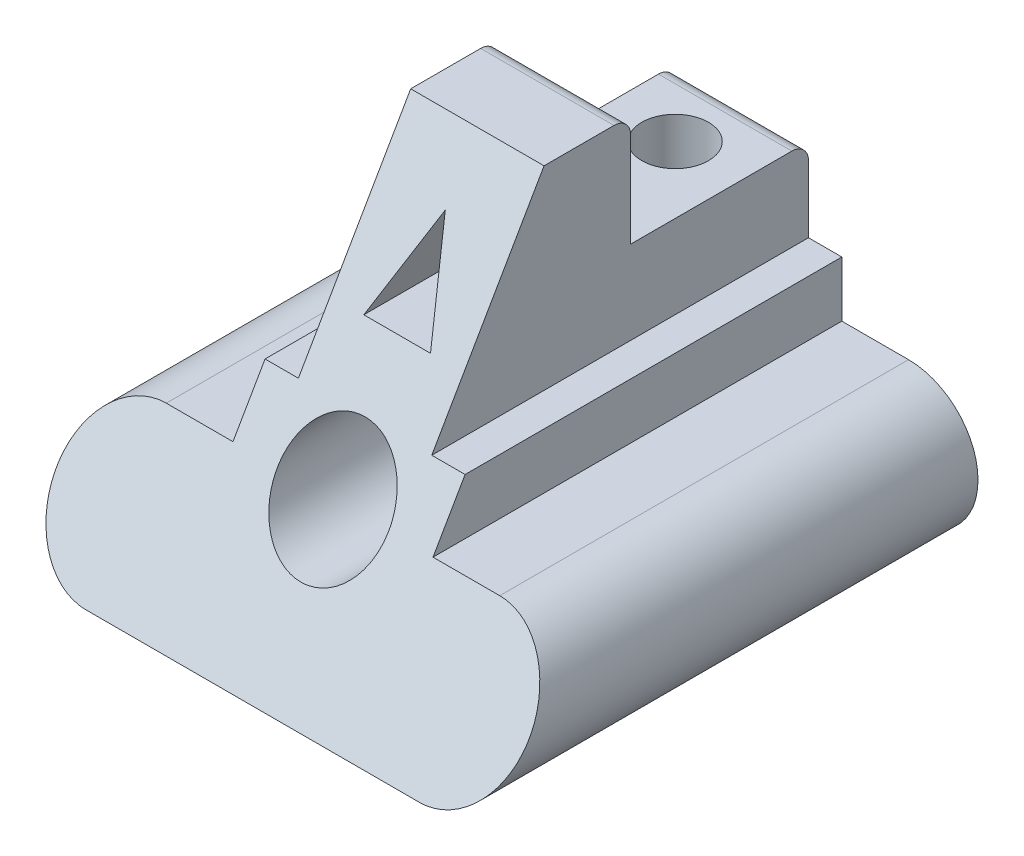
ISO-10303-21;
HEADER;
FILE_DESCRIPTION(('STEP AP214'),'2;1');
FILE_NAME('part.step','',(''),(''),'','','');
FILE_SCHEMA(('AUTOMOTIVE_DESIGN { 1 0 10303 214 1 1 1 1 }'));
ENDSEC;
DATA;
#1=APPLICATION_CONTEXT('core data for automotive mechanical design processes');
#2=APPLICATION_PROTOCOL_DEFINITION('international standard','automotive_design',2000,#1);
#3=PRODUCT_CONTEXT('',#1,'mechanical');
#4=PRODUCT('Part','Part','',(#3));
#5=PRODUCT_RELATED_PRODUCT_CATEGORY('part','',(#4));
#6=PRODUCT_DEFINITION_FORMATION('','',#4);
#7=PRODUCT_DEFINITION_CONTEXT('part definition',#1,'design');
#8=PRODUCT_DEFINITION('design','',#6,#7);
#9=PRODUCT_DEFINITION_SHAPE('','',#8);
#10=(LENGTH_UNIT() NAMED_UNIT(*) SI_UNIT(.MILLI.,.METRE.));
#11=(NAMED_UNIT(*) PLANE_ANGLE_UNIT() SI_UNIT($,.RADIAN.));
#12=(NAMED_UNIT(*) SI_UNIT($,.STERADIAN.) SOLID_ANGLE_UNIT());
#13=UNCERTAINTY_MEASURE_WITH_UNIT(LENGTH_MEASURE(1.E-05),#10,'distance_accuracy_value','');
#14=(GEOMETRIC_REPRESENTATION_CONTEXT(3) GLOBAL_UNCERTAINTY_ASSIGNED_CONTEXT((#13)) GLOBAL_UNIT_ASSIGNED_CONTEXT((#10,
#11,#12)) REPRESENTATION_CONTEXT('',''));
#15=CARTESIAN_POINT('',(0.,0.,0.));
#16=DIRECTION('',(0.,0.,1.));
#17=DIRECTION('',(1.,0.,0.));
#18=AXIS2_PLACEMENT_3D('',#15,#16,#17);
#19=CARTESIAN_POINT('',(-18.,0.,-88.));
#20=DIRECTION('',(-1.,0.,0.));
#21=DIRECTION('',(0.,0.,1.));
#22=AXIS2_PLACEMENT_3D('',#19,#20,#21);
#23=PLANE('',#22);
#24=DIRECTION('',(0.,-1.,0.));
#25=VECTOR('',#24,1.);
#26=CARTESIAN_POINT('',(-18.,0.,-88.));
#27=LINE('',#26,#25);
#28=CARTESIAN_POINT('',(-18.,47.,-88.));
#29=VERTEX_POINT('',#28);
#30=CARTESIAN_POINT('',(-18.,35.,-88.));
#31=VERTEX_POINT('',#30);
#32=EDGE_CURVE('E306',#29,#31,#27,.T.);
#33=ORIENTED_EDGE('',*,*,#32,.F.);
#34=CARTESIAN_POINT('',(-18.,47.,-85.));
#35=DIRECTION('',(-1.,0.,0.));
#36=DIRECTION('',(0.,0.,1.));
#37=AXIS2_PLACEMENT_3D('',#34,#35,#36);
#38=CIRCLE('',#37,3.);
#39=CARTESIAN_POINT('',(-18.,50.,-85.));
#40=VERTEX_POINT('',#39);
#41=EDGE_CURVE('E64',#29,#40,#38,.F.);
#42=ORIENTED_EDGE('',*,*,#41,.T.);
#43=DIRECTION('',(0.,0.,1.));
#44=VECTOR('',#43,1.);
#45=CARTESIAN_POINT('',(-18.,50.,-88.));
#46=LINE('',#45,#44);
#47=CARTESIAN_POINT('',(-18.,50.,-56.));
#48=VERTEX_POINT('',#47);
#49=EDGE_CURVE('E317',#40,#48,#46,.T.);
#50=ORIENTED_EDGE('',*,*,#49,.T.);
#51=DIRECTION('',(0.,-1.,0.));
#52=VECTOR('',#51,1.);
#53=CARTESIAN_POINT('',(-18.,0.,-56.));
#54=LINE('',#53,#52);
#55=CARTESIAN_POINT('',(-18.,67.,-56.));
#56=VERTEX_POINT('',#55);
#57=EDGE_CURVE('E258',#56,#48,#54,.T.);
#58=ORIENTED_EDGE('',*,*,#57,.F.);
#59=CARTESIAN_POINT('',(-18.,67.,-53.));
#60=DIRECTION('',(-1.,0.,0.));
#61=DIRECTION('',(0.,0.,1.));
#62=AXIS2_PLACEMENT_3D('',#59,#60,#61);
#63=CIRCLE('',#62,3.);
#64=CARTESIAN_POINT('',(-18.,70.,-53.));
#65=VERTEX_POINT('',#64);
#66=EDGE_CURVE('E374',#56,#65,#63,.F.);
#67=ORIENTED_EDGE('',*,*,#66,.T.);
#68=DIRECTION('',(0.,0.,1.));
#69=VECTOR('',#68,1.);
#70=CARTESIAN_POINT('',(-18.,70.,-56.));
#71=LINE('',#70,#69);
#72=CARTESIAN_POINT('',(-18.,70.,-40.4145188432733));
#73=VERTEX_POINT('',#72);
#74=EDGE_CURVE('E266',#65,#73,#71,.T.);
#75=ORIENTED_EDGE('',*,*,#74,.T.);
#76=DIRECTION('',(0.,0.866025403784442,-0.499999999999995));
#77=VECTOR('',#76,1.);
#78=CARTESIAN_POINT('',(-18.,70.,-40.4145188432733));
#79=LINE('',#78,#77);
#80=CARTESIAN_POINT('',(-18.,35.,-20.2072594216366));
#81=VERTEX_POINT('',#80);
#82=EDGE_CURVE('E235',#81,#73,#79,.T.);
#83=ORIENTED_EDGE('',*,*,#82,.F.);
#84=DIRECTION('',(0.,0.,1.));
#85=VECTOR('',#84,1.);
#86=CARTESIAN_POINT('',(-18.,35.,-88.));
#87=LINE('',#86,#85);
#88=EDGE_CURVE('E321',#31,#81,#87,.T.);
#89=ORIENTED_EDGE('',*,*,#88,.F.);
#90=EDGE_LOOP('',(#33,#42,#50,#58,#67,#75,#83,#89));
#91=FACE_BOUND('',#90,.T.);
#92=ADVANCED_FACE('F41',(#91),#23,.F.);
#93=CARTESIAN_POINT('',(0.,35.,-88.));
#94=DIRECTION('',(0.,-1.,0.));
#95=DIRECTION('',(0.,0.,-1.));
#96=AXIS2_PLACEMENT_3D('',#93,#94,#95);
#97=PLANE('',#96);
#98=DIRECTION('',(-1.,0.,0.));
#99=VECTOR('',#98,1.);
#100=CARTESIAN_POINT('',(12.501,35.,-20.2072594216366));
#101=LINE('',#100,#99);
#102=CARTESIAN_POINT('',(-12.,35.,-20.2072594216366));
#103=VERTEX_POINT('',#102);
#104=EDGE_CURVE('E232',#103,#81,#101,.T.);
#105=ORIENTED_EDGE('',*,*,#104,.F.);
#106=DIRECTION('',(0.,0.,1.));
#107=VECTOR('',#106,1.);
#108=CARTESIAN_POINT('',(-12.,35.,-88.));
#109=LINE('',#108,#107);
#110=CARTESIAN_POINT('',(-12.,35.,-88.));
#111=VERTEX_POINT('',#110);
#112=EDGE_CURVE('E325',#111,#103,#109,.T.);
#113=ORIENTED_EDGE('',*,*,#112,.F.);
#114=DIRECTION('',(1.,0.,0.));
#115=VECTOR('',#114,1.);
#116=CARTESIAN_POINT('',(0.,35.,-88.));
#117=LINE('',#116,#115);
#118=EDGE_CURVE('E303',#31,#111,#117,.T.);
#119=ORIENTED_EDGE('',*,*,#118,.F.);
#120=ORIENTED_EDGE('',*,*,#88,.T.);
#121=EDGE_LOOP('',(#105,#113,#119,#120));
#122=FACE_BOUND('',#121,.T.);
#123=ADVANCED_FACE('F402',(#122),#97,.F.);
#124=CARTESIAN_POINT('',(-12.,0.,-88.));
#125=DIRECTION('',(-1.,0.,0.));
#126=DIRECTION('',(0.,0.,1.));
#127=AXIS2_PLACEMENT_3D('',#124,#125,#126);
#128=PLANE('',#127);
#129=DIRECTION('',(0.,0.866025403784442,-0.499999999999995));
#130=VECTOR('',#129,1.);
#131=CARTESIAN_POINT('',(-12.,70.,-40.4145188432733));
#132=LINE('',#131,#130);
#133=CARTESIAN_POINT('',(-12.,25.,-14.4337567297405));
#134=VERTEX_POINT('',#133);
#135=EDGE_CURVE('E229',#134,#103,#132,.T.);
#136=ORIENTED_EDGE('',*,*,#135,.F.);
#137=DIRECTION('',(0.,0.,1.));
#138=VECTOR('',#137,1.);
#139=CARTESIAN_POINT('',(-12.,25.,-88.));
#140=LINE('',#139,#138);
#141=CARTESIAN_POINT('',(-12.,25.,-88.));
#142=VERTEX_POINT('',#141);
#143=EDGE_CURVE('E329',#142,#134,#140,.T.);
#144=ORIENTED_EDGE('',*,*,#143,.F.);
#145=DIRECTION('',(0.,-1.,0.));
#146=VECTOR('',#145,1.);
#147=CARTESIAN_POINT('',(-12.,0.,-88.));
#148=LINE('',#147,#146);
#149=EDGE_CURVE('E300',#111,#142,#148,.T.);
#150=ORIENTED_EDGE('',*,*,#149,.F.);
#151=ORIENTED_EDGE('',*,*,#112,.T.);
#152=EDGE_LOOP('',(#136,#144,#150,#151));
#153=FACE_BOUND('',#152,.T.);
#154=ADVANCED_FACE('F410',(#153),#128,.F.);
#155=CARTESIAN_POINT('',(0.,25.,-88.));
#156=DIRECTION('',(0.,-1.,0.));
#157=DIRECTION('',(0.,0.,-1.));
#158=AXIS2_PLACEMENT_3D('',#155,#156,#157);
#159=PLANE('',#158);
#160=DIRECTION('',(-1.,0.,0.));
#161=VECTOR('',#160,1.);
#162=CARTESIAN_POINT('',(12.501,25.,-14.4337567297405));
#163=LINE('',#162,#161);
#164=CARTESIAN_POINT('',(0.,25.,-14.4337567297404));
#165=VERTEX_POINT('',#164);
#166=EDGE_CURVE('E226',#165,#134,#163,.T.);
#167=ORIENTED_EDGE('',*,*,#166,.F.);
#168=DIRECTION('',(0.,0.,1.));
#169=VECTOR('',#168,1.);
#170=CARTESIAN_POINT('',(0.,25.,-88.));
#171=LINE('',#170,#169);
#172=CARTESIAN_POINT('',(0.,25.,-88.));
#173=VERTEX_POINT('',#172);
#174=EDGE_CURVE('E333',#173,#165,#171,.T.);
#175=ORIENTED_EDGE('',*,*,#174,.F.);
#176=DIRECTION('',(1.,0.,0.));
#177=VECTOR('',#176,1.);
#178=CARTESIAN_POINT('',(0.,25.,-88.));
#179=LINE('',#178,#177);
#180=EDGE_CURVE('E297',#142,#173,#179,.T.);
#181=ORIENTED_EDGE('',*,*,#180,.F.);
#182=ORIENTED_EDGE('',*,*,#143,.T.);
#183=EDGE_LOOP('',(#167,#175,#181,#182));
#184=FACE_BOUND('',#183,.T.);
#185=ADVANCED_FACE('F413',(#184),#159,.F.);
#186=CARTESIAN_POINT('',(0.,12.5,-88.));
#187=DIRECTION('',(0.,0.,1.));
#188=DIRECTION('',(1.,0.,0.));
#189=AXIS2_PLACEMENT_3D('',#186,#187,#188);
#190=CYLINDRICAL_SURFACE('',#189,12.5);
#191=ORIENTED_EDGE('',*,*,#174,.T.);
#192=CARTESIAN_POINT('',(0.,12.5,-7.21687836487023));
#193=DIRECTION('',(0.,-0.499999999999995,-0.866025403784442));
#194=DIRECTION('',(0.,-0.866025403784442,0.499999999999995));
#195=AXIS2_PLACEMENT_3D('',#192,#193,#194);
#196=ELLIPSE('',#195,14.4337567297406,12.5);
#197=CARTESIAN_POINT('',(0.,0.,0.));
#198=VERTEX_POINT('',#197);
#199=EDGE_CURVE('E222',#165,#198,#196,.T.);
#200=ORIENTED_EDGE('',*,*,#199,.T.);
#201=DIRECTION('',(0.,0.,1.));
#202=VECTOR('',#201,1.);
#203=CARTESIAN_POINT('',(0.,0.,-88.));
#204=LINE('',#203,#202);
#205=CARTESIAN_POINT('',(0.,0.,-88.));
#206=VERTEX_POINT('',#205);
#207=EDGE_CURVE('E337',#206,#198,#204,.T.);
#208=ORIENTED_EDGE('',*,*,#207,.F.);
#209=CARTESIAN_POINT('',(0.,12.5,-88.));
#210=DIRECTION('',(0.,0.,1.));
#211=DIRECTION('',(1.,0.,0.));
#212=AXIS2_PLACEMENT_3D('',#209,#210,#211);
#213=CIRCLE('',#212,12.5);
#214=EDGE_CURVE('E293',#206,#173,#213,.T.);
#215=ORIENTED_EDGE('',*,*,#214,.T.);
#216=EDGE_LOOP('',(#191,#200,#208,#215));
#217=FACE_BOUND('',#216,.T.);
#218=ADVANCED_FACE('F415',(#217),#190,.T.);
#219=CARTESIAN_POINT('',(-60.,12.5,-88.));
#220=DIRECTION('',(0.,0.,1.));
#221=DIRECTION('',(1.,0.,0.));
#222=AXIS2_PLACEMENT_3D('',#219,#220,#221);
#223=CYLINDRICAL_SURFACE('',#222,12.5);
#224=DIRECTION('',(0.,0.,1.));
#225=VECTOR('',#224,1.);
#226=CARTESIAN_POINT('',(-60.,0.,-88.));
#227=LINE('',#226,#225);
#228=CARTESIAN_POINT('',(-60.,0.,-88.));
#229=VERTEX_POINT('',#228);
#230=CARTESIAN_POINT('',(-60.,0.,0.));
#231=VERTEX_POINT('',#230);
#232=EDGE_CURVE('E341',#229,#231,#227,.T.);
#233=ORIENTED_EDGE('',*,*,#232,.T.);
#234=CARTESIAN_POINT('',(-60.,12.5,-7.21687836487023));
#235=DIRECTION('',(0.,0.499999999999995,0.866025403784442));
#236=DIRECTION('',(0.,-0.866025403784441,0.499999999999995));
#237=AXIS2_PLACEMENT_3D('',#234,#235,#236);
#238=ELLIPSE('',#237,14.4337567297406,12.5);
#239=CARTESIAN_POINT('',(-60.,25.,-14.4337567297405));
#240=VERTEX_POINT('',#239);
#241=EDGE_CURVE('E251',#240,#231,#238,.T.);
#242=ORIENTED_EDGE('',*,*,#241,.F.);
#243=DIRECTION('',(0.,0.,1.));
#244=VECTOR('',#243,1.);
#245=CARTESIAN_POINT('',(-60.,25.,-88.));
#246=LINE('',#245,#244);
#247=CARTESIAN_POINT('',(-60.,25.,-88.));
#248=VERTEX_POINT('',#247);
#249=EDGE_CURVE('E345',#248,#240,#246,.T.);
#250=ORIENTED_EDGE('',*,*,#249,.F.);
#251=CARTESIAN_POINT('',(-60.,12.5,-88.));
#252=DIRECTION('',(0.,0.,1.));
#253=DIRECTION('',(1.,0.,0.));
#254=AXIS2_PLACEMENT_3D('',#251,#252,#253);
#255=CIRCLE('',#254,12.5);
#256=EDGE_CURVE('E286',#248,#229,#255,.T.);
#257=ORIENTED_EDGE('',*,*,#256,.T.);
#258=EDGE_LOOP('',(#233,#242,#250,#257));
#259=FACE_BOUND('',#258,.T.);
#260=ADVANCED_FACE('F423',(#259),#223,.T.);
#261=CARTESIAN_POINT('',(0.,25.,-88.));
#262=DIRECTION('',(0.,-1.,0.));
#263=DIRECTION('',(0.,0.,-1.));
#264=AXIS2_PLACEMENT_3D('',#261,#262,#263);
#265=PLANE('',#264);
#266=DIRECTION('',(1.,0.,0.));
#267=VECTOR('',#266,1.);
#268=CARTESIAN_POINT('',(-72.501,25.,-14.4337567297405));
#269=LINE('',#268,#267);
#270=CARTESIAN_POINT('',(-48.,25.,-14.4337567297404));
#271=VERTEX_POINT('',#270);
#272=EDGE_CURVE('E247',#240,#271,#269,.T.);
#273=ORIENTED_EDGE('',*,*,#272,.T.);
#274=DIRECTION('',(0.,0.,1.));
#275=VECTOR('',#274,1.);
#276=CARTESIAN_POINT('',(-48.,25.,-88.));
#277=LINE('',#276,#275);
#278=CARTESIAN_POINT('',(-48.,25.,-88.));
#279=VERTEX_POINT('',#278);
#280=EDGE_CURVE('E349',#279,#271,#277,.T.);
#281=ORIENTED_EDGE('',*,*,#280,.F.);
#282=DIRECTION('',(1.,0.,0.));
#283=VECTOR('',#282,1.);
#284=CARTESIAN_POINT('',(0.,25.,-88.));
#285=LINE('',#284,#283);
#286=EDGE_CURVE('E283',#248,#279,#285,.T.);
#287=ORIENTED_EDGE('',*,*,#286,.F.);
#288=ORIENTED_EDGE('',*,*,#249,.T.);
#289=EDGE_LOOP('',(#273,#281,#287,#288));
#290=FACE_BOUND('',#289,.T.);
#291=ADVANCED_FACE('F427',(#290),#265,.F.);
#292=CARTESIAN_POINT('',(-48.,0.,-88.));
#293=DIRECTION('',(1.,0.,0.));
#294=DIRECTION('',(0.,0.,-1.));
#295=AXIS2_PLACEMENT_3D('',#292,#293,#294);
#296=PLANE('',#295);
#297=DIRECTION('',(0.,0.866025403784441,-0.499999999999995));
#298=VECTOR('',#297,1.);
#299=CARTESIAN_POINT('',(-48.,70.,-40.4145188432733));
#300=LINE('',#299,#298);
#301=CARTESIAN_POINT('',(-48.,35.,-20.2072594216366));
#302=VERTEX_POINT('',#301);
#303=EDGE_CURVE('E243',#271,#302,#300,.T.);
#304=ORIENTED_EDGE('',*,*,#303,.T.);
#305=DIRECTION('',(0.,0.,1.));
#306=VECTOR('',#305,1.);
#307=CARTESIAN_POINT('',(-48.,35.,-88.));
#308=LINE('',#307,#306);
#309=CARTESIAN_POINT('',(-48.,35.,-88.));
#310=VERTEX_POINT('',#309);
#311=EDGE_CURVE('E353',#310,#302,#308,.T.);
#312=ORIENTED_EDGE('',*,*,#311,.F.);
#313=DIRECTION('',(0.,1.,0.));
#314=VECTOR('',#313,1.);
#315=CARTESIAN_POINT('',(-48.,0.,-88.));
#316=LINE('',#315,#314);
#317=EDGE_CURVE('E280',#279,#310,#316,.T.);
#318=ORIENTED_EDGE('',*,*,#317,.F.);
#319=ORIENTED_EDGE('',*,*,#280,.T.);
#320=EDGE_LOOP('',(#304,#312,#318,#319));
#321=FACE_BOUND('',#320,.T.);
#322=ADVANCED_FACE('F433',(#321),#296,.F.);
#323=CARTESIAN_POINT('',(0.,35.,-88.));
#324=DIRECTION('',(0.,-1.,0.));
#325=DIRECTION('',(0.,0.,-1.));
#326=AXIS2_PLACEMENT_3D('',#323,#324,#325);
#327=PLANE('',#326);
#328=DIRECTION('',(1.,0.,0.));
#329=VECTOR('',#328,1.);
#330=CARTESIAN_POINT('',(-72.501,35.,-20.2072594216366));
#331=LINE('',#330,#329);
#332=CARTESIAN_POINT('',(-42.,35.,-20.2072594216366));
#333=VERTEX_POINT('',#332);
#334=EDGE_CURVE('E239',#302,#333,#331,.T.);
#335=ORIENTED_EDGE('',*,*,#334,.T.);
#336=DIRECTION('',(0.,0.,1.));
#337=VECTOR('',#336,1.);
#338=CARTESIAN_POINT('',(-42.,35.,-88.));
#339=LINE('',#338,#337);
#340=CARTESIAN_POINT('',(-42.,35.,-88.));
#341=VERTEX_POINT('',#340);
#342=EDGE_CURVE('E357',#341,#333,#339,.T.);
#343=ORIENTED_EDGE('',*,*,#342,.F.);
#344=DIRECTION('',(1.,0.,0.));
#345=VECTOR('',#344,1.);
#346=CARTESIAN_POINT('',(0.,35.,-88.));
#347=LINE('',#346,#345);
#348=EDGE_CURVE('E277',#310,#341,#347,.T.);
#349=ORIENTED_EDGE('',*,*,#348,.F.);
#350=ORIENTED_EDGE('',*,*,#311,.T.);
#351=EDGE_LOOP('',(#335,#343,#349,#350));
#352=FACE_BOUND('',#351,.T.);
#353=ADVANCED_FACE('F435',(#352),#327,.F.);
#354=CARTESIAN_POINT('',(-42.,0.,-88.));
#355=DIRECTION('',(1.,0.,0.));
#356=DIRECTION('',(0.,0.,-1.));
#357=AXIS2_PLACEMENT_3D('',#354,#355,#356);
#358=PLANE('',#357);
#359=DIRECTION('',(0.,0.,1.));
#360=VECTOR('',#359,1.);
#361=CARTESIAN_POINT('',(-42.,50.,-88.));
#362=LINE('',#361,#360);
#363=CARTESIAN_POINT('',(-42.,50.,-85.));
#364=VERTEX_POINT('',#363);
#365=CARTESIAN_POINT('',(-42.,50.,-56.));
#366=VERTEX_POINT('',#365);
#367=EDGE_CURVE('E313',#364,#366,#362,.T.);
#368=ORIENTED_EDGE('',*,*,#367,.F.);
#369=CARTESIAN_POINT('',(-42.,47.,-85.));
#370=DIRECTION('',(1.,0.,0.));
#371=DIRECTION('',(0.,0.,-1.));
#372=AXIS2_PLACEMENT_3D('',#369,#370,#371);
#373=CIRCLE('',#372,3.);
#374=CARTESIAN_POINT('',(-42.,47.,-88.));
#375=VERTEX_POINT('',#374);
#376=EDGE_CURVE('E11',#364,#375,#373,.F.);
#377=ORIENTED_EDGE('',*,*,#376,.T.);
#378=DIRECTION('',(0.,1.,0.));
#379=VECTOR('',#378,1.);
#380=CARTESIAN_POINT('',(-42.,0.,-88.));
#381=LINE('',#380,#379);
#382=EDGE_CURVE('E273',#341,#375,#381,.T.);
#383=ORIENTED_EDGE('',*,*,#382,.F.);
#384=ORIENTED_EDGE('',*,*,#342,.T.);
#385=DIRECTION('',(0.,-0.866025403784442,0.499999999999995));
#386=VECTOR('',#385,1.);
#387=CARTESIAN_POINT('',(-42.,70.,-40.4145188432733));
#388=LINE('',#387,#386);
#389=CARTESIAN_POINT('',(-42.,70.,-40.4145188432733));
#390=VERTEX_POINT('',#389);
#391=EDGE_CURVE('E209',#390,#333,#388,.T.);
#392=ORIENTED_EDGE('',*,*,#391,.F.);
#393=DIRECTION('',(0.,0.,1.));
#394=VECTOR('',#393,1.);
#395=CARTESIAN_POINT('',(-42.,70.,-56.));
#396=LINE('',#395,#394);
#397=CARTESIAN_POINT('',(-42.,70.,-53.));
#398=VERTEX_POINT('',#397);
#399=EDGE_CURVE('E267',#398,#390,#396,.T.);
#400=ORIENTED_EDGE('',*,*,#399,.F.);
#401=CARTESIAN_POINT('',(-42.,67.,-53.));
#402=DIRECTION('',(1.,0.,0.));
#403=DIRECTION('',(0.,0.,-1.));
#404=AXIS2_PLACEMENT_3D('',#401,#402,#403);
#405=CIRCLE('',#404,3.);
#406=CARTESIAN_POINT('',(-42.,67.,-56.));
#407=VERTEX_POINT('',#406);
#408=EDGE_CURVE('E380',#398,#407,#405,.F.);
#409=ORIENTED_EDGE('',*,*,#408,.T.);
#410=DIRECTION('',(0.,1.,0.));
#411=VECTOR('',#410,1.);
#412=CARTESIAN_POINT('',(-42.,0.,-56.));
#413=LINE('',#412,#411);
#414=EDGE_CURVE('E262',#366,#407,#413,.T.);
#415=ORIENTED_EDGE('',*,*,#414,.F.);
#416=EDGE_LOOP('',(#368,#377,#383,#384,#392,#400,#409,#415));
#417=FACE_BOUND('',#416,.T.);
#418=ADVANCED_FACE('F438',(#417),#358,.F.);
#419=CARTESIAN_POINT('',(-30.,25.,-88.));
#420=DIRECTION('',(0.,0.,1.));
#421=DIRECTION('',(1.,0.,0.));
#422=AXIS2_PLACEMENT_3D('',#419,#420,#421);
#423=CYLINDRICAL_SURFACE('',#422,10.);
#424=CARTESIAN_POINT('',(-30.,35.,-70.));
#425=CARTESIAN_POINT('',(-30.1535374445514,34.9999988316864,-70.0000012548086));
#426=CARTESIAN_POINT('',(-30.3071137293949,34.9964549609116,-70.0059026426005));
#427=CARTESIAN_POINT('',(-30.6131075213269,34.9823636446367,-70.0294330131588));
#428=CARTESIAN_POINT('',(-30.7655242976,34.9718121013094,-70.0470688578121));
#429=CARTESIAN_POINT('',(-31.0682474515099,34.9439424991895,-70.0938721043492));
#430=CARTESIAN_POINT('',(-31.2185492725192,34.926611630499,-70.1230613382259));
#431=CARTESIAN_POINT('',(-31.515720027274,34.8856010527718,-70.1925999382584));
#432=CARTESIAN_POINT('',(-31.6625874660599,34.861918632895,-70.2329540698223));
#433=CARTESIAN_POINT('',(-31.9510956153095,34.8089048196691,-70.3240876008969));
#434=CARTESIAN_POINT('',(-32.0927603969022,34.7796048316485,-70.37480914043));
#435=CARTESIAN_POINT('',(-32.3709308379964,34.7159192851634,-70.4862743691114));
#436=CARTESIAN_POINT('',(-32.5074344790554,34.6815317623513,-70.5470219304578));
#437=CARTESIAN_POINT('',(-32.9079629165862,34.5718416230334,-70.7433840785194));
#438=CARTESIAN_POINT('',(-33.1633697760085,34.4899416782257,-70.8932348593339));
#439=CARTESIAN_POINT('',(-33.665237700711,34.3082107009322,-71.2391081430814));
#440=CARTESIAN_POINT('',(-33.9095211248015,34.2074873986189,-71.4377851324869));
#441=CARTESIAN_POINT('',(-34.3635457904212,34.0012018374476,-71.869898502178));
#442=CARTESIAN_POINT('',(-34.5732420237422,33.8956334984452,-72.1033794326266));
#443=CARTESIAN_POINT('',(-34.8708257878284,33.7344116695649,-72.4919989978208));
#444=CARTESIAN_POINT('',(-34.9718233084264,33.6771572447259,-72.6366326182451));
#445=CARTESIAN_POINT('',(-35.1612212273106,33.5658531778253,-72.9351943573764));
#446=CARTESIAN_POINT('',(-35.249619545053,33.511804065925,-73.0891240052026));
#447=CARTESIAN_POINT('',(-35.412907752376,33.4089084373516,-73.4053776824132));
#448=CARTESIAN_POINT('',(-35.4878152818546,33.360055161608,-73.5676903876683));
#449=CARTESIAN_POINT('',(-35.6233816335401,33.2694758932373,-73.9000581708195));
#450=CARTESIAN_POINT('',(-35.6840457731234,33.2277472424206,-74.0701103310086));
#451=CARTESIAN_POINT('',(-35.7773722189276,33.1623761155473,-74.374920079138));
#452=CARTESIAN_POINT('',(-35.8132588951073,33.1367995429573,-74.5082833488659));
#453=CARTESIAN_POINT('',(-35.8759003935067,33.0916802112336,-74.7781295178189));
#454=CARTESIAN_POINT('',(-35.9026572388137,33.0721361154497,-74.9146117187559));
#455=CARTESIAN_POINT('',(-35.9466697053967,33.0397678987806,-75.1897482859787));
#456=CARTESIAN_POINT('',(-35.9639350903157,33.0269368729764,-75.3284002686418));
#457=CARTESIAN_POINT('',(-35.9887526638035,33.0084382539003,-75.607055015301));
#458=CARTESIAN_POINT('',(-35.9963046851772,33.0027707839339,-75.7470578025065));
#459=CARTESIAN_POINT('',(-36.0015799077122,32.998815553011,-76.027630485736));
#460=CARTESIAN_POINT('',(-35.999283729664,33.0005423424093,-76.1682009556071));
#461=CARTESIAN_POINT('',(-35.9848566861032,33.0113400735373,-76.448547368446));
#462=CARTESIAN_POINT('',(-35.972725772806,33.0204110509506,-76.58832330755));
#463=CARTESIAN_POINT('',(-35.9388058403825,33.0455596519721,-76.8661231944088));
#464=CARTESIAN_POINT('',(-35.9170124664743,33.06164043478,-77.0041463233038));
#465=CARTESIAN_POINT('',(-35.864078941477,33.1002247186829,-77.2774945910759));
#466=CARTESIAN_POINT('',(-35.8329349705306,33.1227308444406,-77.4128186031844));
#467=CARTESIAN_POINT('',(-35.7269806380151,33.1981212708969,-77.8099607815556));
#468=CARTESIAN_POINT('',(-35.6391519413127,33.2592688813843,-78.0668706370872));
#469=CARTESIAN_POINT('',(-35.4318004749303,33.3970816357885,-78.5628175566807));
#470=CARTESIAN_POINT('',(-35.3122660865017,33.4737524658433,-78.8018480274799));
#471=CARTESIAN_POINT('',(-35.0207007696374,33.6502223473554,-79.2999480266043));
#472=CARTESIAN_POINT('',(-34.8431455012107,33.7517214207022,-79.5552148804664));
#473=CARTESIAN_POINT('',(-34.5495712428061,33.9058241072835,-79.9147691760174));
#474=CARTESIAN_POINT('',(-34.4470831857426,33.9575413604803,-80.0308102231317));
#475=CARTESIAN_POINT('',(-34.2332943780155,34.0605341567508,-80.2547824138109));
#476=CARTESIAN_POINT('',(-34.1219920618319,34.1118096195559,-80.3627121100362));
#477=CARTESIAN_POINT('',(-33.8748185747841,34.2198932657038,-80.5844378033889));
#478=CARTESIAN_POINT('',(-33.7376879526544,34.2764728236517,-80.6969446098408));
#479=CARTESIAN_POINT('',(-33.4531412294245,34.3861094114166,-80.9099266645909));
#480=CARTESIAN_POINT('',(-33.3057291557259,34.4391678048096,-81.0104065825761));
#481=CARTESIAN_POINT('',(-33.0013005996816,34.5403310213358,-81.1984805100332));
#482=CARTESIAN_POINT('',(-32.8442852582777,34.5884364311062,-81.2860760460744));
#483=CARTESIAN_POINT('',(-32.5215578357828,34.6783154459773,-81.447410241838));
#484=CARTESIAN_POINT('',(-32.3558468373731,34.7200898368359,-81.5211506214301));
#485=CARTESIAN_POINT('',(-32.0275727821296,34.793642552671,-81.649604220474));
#486=CARTESIAN_POINT('',(-31.8654685151806,34.8258846678739,-81.705223147606));
#487=CARTESIAN_POINT('',(-31.5358472206787,34.8827695547172,-81.8026459542524));
#488=CARTESIAN_POINT('',(-31.368330348628,34.9074125444634,-81.8444502302696));
#489=CARTESIAN_POINT('',(-31.0294936906507,34.9483281848036,-81.9135444927888));
#490=CARTESIAN_POINT('',(-30.8581778733743,34.9646091775131,-81.9408489455661));
#491=CARTESIAN_POINT('',(-30.5132263060323,34.9883166876579,-81.9805289353702));
#492=CARTESIAN_POINT('',(-30.3395908857352,34.9957444504556,-81.9929065721186));
#493=CARTESIAN_POINT('',(-30.0154285942464,35.0011181661532,-82.0018638200681));
#494=CARTESIAN_POINT('',(-29.8649696833069,35.0002160020556,-82.0003625940574));
#495=CARTESIAN_POINT('',(-29.5647817388293,34.9916527590154,-81.9860804379589));
#496=CARTESIAN_POINT('',(-29.4150526814114,34.9839919027215,-81.9732998794413));
#497=CARTESIAN_POINT('',(-29.1174639434087,34.9620977528579,-81.9366326369675));
#498=CARTESIAN_POINT('',(-28.9696041358731,34.9478649081176,-81.9127467114441));
#499=CARTESIAN_POINT('',(-28.6767875278227,34.913165472997,-81.8541784518886));
#500=CARTESIAN_POINT('',(-28.5318307994818,34.8926987278392,-81.8194958497923));
#501=CARTESIAN_POINT('',(-28.2492809137098,34.846571044534,-81.740727839033));
#502=CARTESIAN_POINT('',(-28.1115943317423,34.8210503421429,-81.6968948586283));
#503=CARTESIAN_POINT('',(-27.8406097072549,34.7650505429172,-81.599801467025));
#504=CARTESIAN_POINT('',(-27.7073130952241,34.7345698487,-81.5465380182235));
#505=CARTESIAN_POINT('',(-27.3150746398879,34.6365771020272,-81.3733367560108));
#506=CARTESIAN_POINT('',(-27.0635771361598,34.5624792512599,-81.2399295203489));
#507=CARTESIAN_POINT('',(-26.559938705681,34.3938169931894,-80.9257648803305));
#508=CARTESIAN_POINT('',(-26.3104385848452,34.2979267324494,-80.7415307371737));
#509=CARTESIAN_POINT('',(-25.8438806703038,34.0989559830121,-80.3384083420504));
#510=CARTESIAN_POINT('',(-25.6268612076678,33.9958672062616,-80.1194797638093));
#511=CARTESIAN_POINT('',(-25.3152380729324,33.8356718005112,-79.75276518009));
#512=CARTESIAN_POINT('',(-25.2084104966445,33.778044524743,-79.6153895839449));
#513=CARTESIAN_POINT('',(-25.0066736219998,33.6648744163924,-79.3312226254713));
#514=CARTESIAN_POINT('',(-24.9117674048867,33.6093321252939,-79.1844288436304));
#515=CARTESIAN_POINT('',(-24.7346543173584,33.5021674243621,-78.8821531306063));
#516=CARTESIAN_POINT('',(-24.6524389574815,33.4505424059525,-78.7266771029891));
#517=CARTESIAN_POINT('',(-24.5014437197372,33.3530803885915,-78.4076913158731));
#518=CARTESIAN_POINT('',(-24.4326543353319,33.3072393023986,-78.2441873441473));
#519=CARTESIAN_POINT('',(-24.3226361414009,33.2323122494551,-77.9460369976618));
#520=CARTESIAN_POINT('',(-24.2786629081551,33.2017448333722,-77.8127706139868));
#521=CARTESIAN_POINT('',(-24.1999430911377,33.1462666751069,-77.5424462632691));
#522=CARTESIAN_POINT('',(-24.1651916589615,33.1213529614662,-77.4053903306202));
#523=CARTESIAN_POINT('',(-24.1053431114613,33.0780187986244,-77.1283115957084));
#524=CARTESIAN_POINT('',(-24.0802364852157,33.0595919541091,-76.9882918606535));
#525=CARTESIAN_POINT('',(-24.0399846267175,33.0298721008586,-76.7060674786414));
#526=CARTESIAN_POINT('',(-24.0248394526256,33.0185791337751,-76.5638628189323));
#527=CARTESIAN_POINT('',(-24.0047124666298,33.0035422228399,-76.2777861758265));
#528=CARTESIAN_POINT('',(-23.9997696276852,32.999827227501,-76.1339099024415));
#529=CARTESIAN_POINT('',(-24.0002468824252,33.0001851553603,-75.8461842597292));
#530=CARTESIAN_POINT('',(-24.005666994323,33.0042580922459,-75.7023348904497));
#531=CARTESIAN_POINT('',(-24.0267840675712,33.0200288626228,-75.4157510433412));
#532=CARTESIAN_POINT('',(-24.0424859164029,33.0317303223635,-75.2730171284189));
#533=CARTESIAN_POINT('',(-24.083921447684,33.0622995620907,-74.9898018457589));
#534=CARTESIAN_POINT('',(-24.1096551715569,33.0811673716685,-74.8493204873248));
#535=CARTESIAN_POINT('',(-24.1693048476433,33.1243016324959,-74.5782741425903));
#536=CARTESIAN_POINT('',(-24.2027629088097,33.1482615152427,-74.4475588407941));
#537=CARTESIAN_POINT('',(-24.2780619797536,33.2013135481482,-74.189614258587));
#538=CARTESIAN_POINT('',(-24.3199058165761,33.2304074287039,-74.0623861702863));
#539=CARTESIAN_POINT('',(-24.4574364217011,33.3242003063792,-73.6867725384604));
#540=CARTESIAN_POINT('',(-24.5651530740274,33.3954338396623,-73.4443200465292));
#541=CARTESIAN_POINT('',(-24.8284343102179,33.5605234540185,-72.9426872635962));
#542=CARTESIAN_POINT('',(-24.9888059894422,33.6561736985039,-72.6866538743708));
#543=CARTESIAN_POINT('',(-25.3449993905324,33.8528148941367,-72.2024614046252));
#544=CARTESIAN_POINT('',(-25.5408503045263,33.9538101943659,-71.9743255389018));
#545=CARTESIAN_POINT('',(-25.8762965852916,34.1111867281611,-71.63816339612));
#546=CARTESIAN_POINT('',(-26.0052130503563,34.1685800195261,-71.5197749573298));
#547=CARTESIAN_POINT('',(-26.2735306870929,34.2808698840721,-71.2942465024977));
#548=CARTESIAN_POINT('',(-26.4129286333343,34.3357672170491,-71.1871030501927));
#549=CARTESIAN_POINT('',(-26.701713245057,34.4416618816468,-70.9847819954334));
#550=CARTESIAN_POINT('',(-26.8511069152599,34.492656423499,-70.8896129217052));
#551=CARTESIAN_POINT('',(-27.1590354185457,34.5893142593643,-70.7122331487959));
#552=CARTESIAN_POINT('',(-27.3175691036253,34.6349782207385,-70.6300208270442));
#553=CARTESIAN_POINT('',(-27.6378865059941,34.7183831908137,-70.4817928441745));
#554=CARTESIAN_POINT('',(-27.7994257427609,34.756322524215,-70.4153615047739));
#555=CARTESIAN_POINT('',(-28.1290597344728,34.8248615436109,-70.296469046806));
#556=CARTESIAN_POINT('',(-28.2971532247012,34.8554626375324,-70.2440052481898));
#557=CARTESIAN_POINT('',(-28.6379936129401,34.908309152357,-70.1539830566488));
#558=CARTESIAN_POINT('',(-28.8107242222368,34.9305805364949,-70.1163783277853));
#559=CARTESIAN_POINT('',(-29.159633283855,34.9661667207587,-70.0565108073647));
#560=CARTESIAN_POINT('',(-29.3358087384079,34.9794889802547,-70.0342352381028));
#561=CARTESIAN_POINT('',(-29.5937519796453,34.9920745749358,-70.013216627627));
#562=CARTESIAN_POINT('',(-29.6748871307677,34.9950440553602,-70.0082630243228));
#563=CARTESIAN_POINT('',(-29.8373445506425,34.9990071116074,-70.0016543209453));
#564=CARTESIAN_POINT('',(-29.9186668257878,35.0000006188891,-69.999999335292));
#565=CARTESIAN_POINT('',(-30.,35.,-70.));
#566=B_SPLINE_CURVE_WITH_KNOTS('',3,(#424,#425,#426,#427,#428,#429,#430,#431,#432,#433,#434,
#435,#436,#437,#438,#439,#440,#441,#442,#443,#444,#445,#446,#447,#448,#449,#450,#451,#452,#453,
#454,#455,#456,#457,#458,#459,#460,#461,#462,#463,#464,#465,#466,#467,#468,#469,#470,#471,#472,
#473,#474,#475,#476,#477,#478,#479,#480,#481,#482,#483,#484,#485,#486,#487,#488,#489,#490,#491,
#492,#493,#494,#495,#496,#497,#498,#499,#500,#501,#502,#503,#504,#505,#506,#507,#508,#509,#510,
#511,#512,#513,#514,#515,#516,#517,#518,#519,#520,#521,#522,#523,#524,#525,#526,#527,#528,#529,
#530,#531,#532,#533,#534,#535,#536,#537,#538,#539,#540,#541,#542,#543,#544,#545,#546,#547,#548,
#549,#550,#551,#552,#553,#554,#555,#556,#557,#558,#559,#560,#561,#562,#563,#564,#565),
.UNSPECIFIED.,.T.,.F.,(4,2,2,2,2,2,2,2,2,2,2,2,2,2,2,2,2,2,2,2,2,2,2,2,2,2,2,2,2,2,2,2,2,2,2,2,
2,2,2,2,2,2,2,2,2,2,2,2,2,2,2,2,2,2,2,2,2,2,2,2,2,2,2,2,2,2,2,2,2,2,4),(0.,0.460526601189237,
0.921322738666802,1.38299381403057,1.8448622449067,2.30422013956031,2.76375586197537,
3.68167311554443,4.66978395284545,5.65917064091953,6.21499415637786,6.77090935054836,
7.32609229452151,7.8810676455441,8.30201487574486,8.72286876721019,9.1432889221606,
9.56371631366182,9.98497139806242,10.40622852925,10.8276757104407,11.2492952938387,
12.0807558666506,12.9125215553463,13.8897049719634,14.3790534646455,14.8684890673691,
15.4263461011955,15.983985828052,16.5415594312421,17.0990637758595,17.6214641151699,
18.1438494594443,18.6657126431692,19.1875024090024,19.638346895262,20.0891765301004,
20.5399753803935,20.9907854241961,21.4305002375879,21.8703569439357,22.7494233427058,
23.7197001490793,24.6911131196183,25.2405264723239,25.7900815377538,26.3392673739261,
26.8880629256888,27.3185187217207,27.7487477532129,28.1785514321197,28.6083576204496,
29.0398026540948,29.4712484460159,29.9028994771413,30.3345522906549,30.7452488920627,
31.156084182716,31.9773303104338,32.9246646516038,33.8727820243207,34.4248169890477,
34.9766827677429,35.5289394130232,36.0811268442984,36.6165634055116,37.1518971546363,
37.6855481107011,38.2187536985203,38.4626993445495,38.706653452248),.UNSPECIFIED.);
#567=CARTESIAN_POINT('',(-30.,35.,-70.));
#568=VERTEX_POINT('',#567);
#569=EDGE_CURVE('E196',#568,#568,#566,.T.);
#570=ORIENTED_EDGE('',*,*,#569,.F.);
#571=EDGE_LOOP('',(#570));
#572=FACE_BOUND('',#571,.T.);
#573=CARTESIAN_POINT('',(-30.,25.,-88.));
#574=DIRECTION('',(0.,0.,1.));
#575=DIRECTION('',(1.,0.,0.));
#576=AXIS2_PLACEMENT_3D('',#573,#574,#575);
#577=CIRCLE('',#576,10.);
#578=CARTESIAN_POINT('',(-20.,25.,-88.));
#579=VERTEX_POINT('',#578);
#580=EDGE_CURVE('E309',#579,#579,#577,.T.);
#581=ORIENTED_EDGE('',*,*,#580,.F.);
#582=EDGE_LOOP('',(#581));
#583=FACE_BOUND('',#582,.T.);
#584=CARTESIAN_POINT('',(-30.,25.,-14.4337567297404));
#585=DIRECTION('',(0.,-0.499999999999995,-0.866025403784442));
#586=DIRECTION('',(0.,-0.866025403784442,0.499999999999995));
#587=AXIS2_PLACEMENT_3D('',#584,#585,#586);
#588=ELLIPSE('',#587,11.5470053837925,10.);
#589=CARTESIAN_POINT('',(-30.,15.,-8.66025403784426));
#590=VERTEX_POINT('',#589);
#591=EDGE_CURVE('E218',#590,#590,#588,.T.);
#592=ORIENTED_EDGE('',*,*,#591,.F.);
#593=EDGE_LOOP('',(#592));
#594=FACE_BOUND('',#593,.T.);
#595=ADVANCED_FACE('F454',(#572,#583,#594),#423,.F.);
#596=CARTESIAN_POINT('',(0.,70.,-56.));
#597=DIRECTION('',(0.,-1.,0.));
#598=DIRECTION('',(0.,0.,-1.));
#599=AXIS2_PLACEMENT_3D('',#596,#597,#598);
#600=PLANE('',#599);
#601=ORIENTED_EDGE('',*,*,#74,.F.);
#602=DIRECTION('',(1.,0.,0.));
#603=VECTOR('',#602,1.);
#604=CARTESIAN_POINT('',(0.,70.,-53.));
#605=LINE('',#604,#603);
#606=EDGE_CURVE('E377',#65,#398,#605,.F.);
#607=ORIENTED_EDGE('',*,*,#606,.T.);
#608=ORIENTED_EDGE('',*,*,#399,.T.);
#609=DIRECTION('',(-1.,0.,0.));
#610=VECTOR('',#609,1.);
#611=CARTESIAN_POINT('',(12.501,70.,-40.4145188432733));
#612=LINE('',#611,#610);
#613=EDGE_CURVE('E214',#73,#390,#612,.T.);
#614=ORIENTED_EDGE('',*,*,#613,.F.);
#615=EDGE_LOOP('',(#601,#607,#608,#614));
#616=FACE_BOUND('',#615,.T.);
#617=ADVANCED_FACE('F477',(#616),#600,.F.);
#618=CARTESIAN_POINT('',(0.,50.,-88.));
#619=DIRECTION('',(0.,-1.,0.));
#620=DIRECTION('',(0.,0.,-1.));
#621=AXIS2_PLACEMENT_3D('',#618,#619,#620);
#622=PLANE('',#621);
#623=CARTESIAN_POINT('',(-30.,50.,-76.));
#624=DIRECTION('',(0.,1.,0.));
#625=DIRECTION('',(0.,0.,1.));
#626=AXIS2_PLACEMENT_3D('',#623,#624,#625);
#627=CIRCLE('',#626,6.);
#628=CARTESIAN_POINT('',(-30.,50.,-70.));
#629=VERTEX_POINT('',#628);
#630=EDGE_CURVE('E200',#629,#629,#627,.T.);
#631=ORIENTED_EDGE('',*,*,#630,.F.);
#632=EDGE_LOOP('',(#631));
#633=FACE_BOUND('',#632,.T.);
#634=ORIENTED_EDGE('',*,*,#49,.F.);
#635=DIRECTION('',(1.,0.,0.));
#636=VECTOR('',#635,1.);
#637=CARTESIAN_POINT('',(0.,50.,-85.));
#638=LINE('',#637,#636);
#639=EDGE_CURVE('E50',#40,#364,#638,.F.);
#640=ORIENTED_EDGE('',*,*,#639,.T.);
#641=ORIENTED_EDGE('',*,*,#367,.T.);
#642=DIRECTION('',(1.,0.,0.));
#643=VECTOR('',#642,1.);
#644=CARTESIAN_POINT('',(0.,50.,-56.));
#645=LINE('',#644,#643);
#646=EDGE_CURVE('E254',#366,#48,#645,.T.);
#647=ORIENTED_EDGE('',*,*,#646,.T.);
#648=EDGE_LOOP('',(#634,#640,#641,#647));
#649=FACE_BOUND('',#648,.T.);
#650=ADVANCED_FACE('F465',(#633,#649),#622,.F.);
#651=CARTESIAN_POINT('',(0.,0.,-88.));
#652=DIRECTION('',(0.,1.,0.));
#653=DIRECTION('',(-1.,0.,0.));
#654=AXIS2_PLACEMENT_3D('',#651,#652,#653);
#655=PLANE('',#654);
#656=DIRECTION('',(-1.,0.,0.));
#657=VECTOR('',#656,1.);
#658=CARTESIAN_POINT('',(0.,0.,0.));
#659=LINE('',#658,#657);
#660=EDGE_CURVE('E270',#198,#231,#659,.T.);
#661=ORIENTED_EDGE('',*,*,#660,.T.);
#662=ORIENTED_EDGE('',*,*,#232,.F.);
#663=DIRECTION('',(-1.,0.,0.));
#664=VECTOR('',#663,1.);
#665=CARTESIAN_POINT('',(0.,0.,-88.));
#666=LINE('',#665,#664);
#667=EDGE_CURVE('E290',#206,#229,#666,.T.);
#668=ORIENTED_EDGE('',*,*,#667,.F.);
#669=ORIENTED_EDGE('',*,*,#207,.T.);
#670=EDGE_LOOP('',(#661,#662,#668,#669));
#671=FACE_BOUND('',#670,.T.);
#672=ADVANCED_FACE('F420',(#671),#655,.F.);
#673=CARTESIAN_POINT('',(0.,0.,-88.));
#674=DIRECTION('',(0.,0.,1.));
#675=DIRECTION('',(1.,0.,0.));
#676=AXIS2_PLACEMENT_3D('',#673,#674,#675);
#677=PLANE('',#676);
#678=ORIENTED_EDGE('',*,*,#382,.T.);
#679=DIRECTION('',(1.,0.,0.));
#680=VECTOR('',#679,1.);
#681=CARTESIAN_POINT('',(0.,47.,-88.));
#682=LINE('',#681,#680);
#683=EDGE_CURVE('E383',#375,#29,#682,.T.);
#684=ORIENTED_EDGE('',*,*,#683,.T.);
#685=ORIENTED_EDGE('',*,*,#32,.T.);
#686=ORIENTED_EDGE('',*,*,#118,.T.);
#687=ORIENTED_EDGE('',*,*,#149,.T.);
#688=ORIENTED_EDGE('',*,*,#180,.T.);
#689=ORIENTED_EDGE('',*,*,#214,.F.);
#690=ORIENTED_EDGE('',*,*,#667,.T.);
#691=ORIENTED_EDGE('',*,*,#256,.F.);
#692=ORIENTED_EDGE('',*,*,#286,.T.);
#693=ORIENTED_EDGE('',*,*,#317,.T.);
#694=ORIENTED_EDGE('',*,*,#348,.T.);
#695=EDGE_LOOP('',(#678,#684,#685,#686,#687,#688,#689,#690,#691,#692,#693,#694));
#696=FACE_BOUND('',#695,.T.);
#697=ORIENTED_EDGE('',*,*,#580,.T.);
#698=EDGE_LOOP('',(#697));
#699=FACE_BOUND('',#698,.T.);
#700=ADVANCED_FACE('F391',(#696,#699),#677,.F.);
#701=CARTESIAN_POINT('',(0.,0.,-56.));
#702=DIRECTION('',(0.,0.,1.));
#703=DIRECTION('',(1.,0.,0.));
#704=AXIS2_PLACEMENT_3D('',#701,#702,#703);
#705=PLANE('',#704);
#706=ORIENTED_EDGE('',*,*,#414,.T.);
#707=DIRECTION('',(1.,0.,0.));
#708=VECTOR('',#707,1.);
#709=CARTESIAN_POINT('',(0.,67.,-56.));
#710=LINE('',#709,#708);
#711=EDGE_CURVE('E370',#407,#56,#710,.T.);
#712=ORIENTED_EDGE('',*,*,#711,.T.);
#713=ORIENTED_EDGE('',*,*,#57,.T.);
#714=ORIENTED_EDGE('',*,*,#646,.F.);
#715=EDGE_LOOP('',(#706,#712,#713,#714));
#716=FACE_BOUND('',#715,.T.);
#717=ADVANCED_FACE('F489',(#716),#705,.F.);
#718=CARTESIAN_POINT('',(-72.501,70.,-40.4145188432733));
#719=DIRECTION('',(0.,0.499999999999995,0.866025403784442));
#720=DIRECTION('',(0.,-0.866025403784441,0.499999999999995));
#721=AXIS2_PLACEMENT_3D('',#718,#719,#720);
#722=PLANE('',#721);
#723=DIRECTION('',(1.,0.,0.));
#724=VECTOR('',#723,1.);
#725=CARTESIAN_POINT('',(-72.501,45.,-25.9807621135328));
#726=LINE('',#725,#724);
#727=CARTESIAN_POINT('',(-36.,45.,-25.9807621135328));
#728=VERTEX_POINT('',#727);
#729=CARTESIAN_POINT('',(-24.,45.,-25.9807621135328));
#730=VERTEX_POINT('',#729);
#731=EDGE_CURVE('E179',#728,#730,#726,.T.);
#732=ORIENTED_EDGE('',*,*,#731,.F.);
#733=DIRECTION('',(-0.327326835353989,-0.818317088384974,0.472455591261529));
#734=VECTOR('',#733,1.);
#735=CARTESIAN_POINT('',(-30.98225,57.5443749999999,-33.2232603965983));
#736=LINE('',#735,#734);
#737=CARTESIAN_POINT('',(-30.,60.,-34.6410161513771));
#738=VERTEX_POINT('',#737);
#739=EDGE_CURVE('E365',#738,#728,#736,.T.);
#740=ORIENTED_EDGE('',*,*,#739,.F.);
#741=DIRECTION('',(-0.327326835353989,0.818317088384974,-0.472455591261529));
#742=VECTOR('',#741,1.);
#743=CARTESIAN_POINT('',(-38.1251071428572,80.3127678571429,-46.3685981416848));
#744=LINE('',#743,#742);
#745=EDGE_CURVE('E320',#730,#738,#744,.T.);
#746=ORIENTED_EDGE('',*,*,#745,.F.);
#747=EDGE_LOOP('',(#732,#740,#746));
#748=FACE_BOUND('',#747,.T.);
#749=ORIENTED_EDGE('',*,*,#241,.T.);
#750=ORIENTED_EDGE('',*,*,#660,.F.);
#751=ORIENTED_EDGE('',*,*,#199,.F.);
#752=ORIENTED_EDGE('',*,*,#166,.T.);
#753=ORIENTED_EDGE('',*,*,#135,.T.);
#754=ORIENTED_EDGE('',*,*,#104,.T.);
#755=ORIENTED_EDGE('',*,*,#82,.T.);
#756=ORIENTED_EDGE('',*,*,#613,.T.);
#757=ORIENTED_EDGE('',*,*,#391,.T.);
#758=ORIENTED_EDGE('',*,*,#334,.F.);
#759=ORIENTED_EDGE('',*,*,#303,.F.);
#760=ORIENTED_EDGE('',*,*,#272,.F.);
#761=EDGE_LOOP('',(#749,#750,#751,#752,#753,#754,#755,#756,#757,#758,#759,#760));
#762=FACE_BOUND('',#761,.T.);
#763=ORIENTED_EDGE('',*,*,#591,.T.);
#764=EDGE_LOOP('',(#763));
#765=FACE_BOUND('',#764,.T.);
#766=ADVANCED_FACE('F497',(#748,#762,#765),#722,.T.);
#767=CARTESIAN_POINT('',(-36.,45.,-50.));
#768=DIRECTION('',(0.,-1.,0.));
#769=DIRECTION('',(0.,0.,-1.));
#770=AXIS2_PLACEMENT_3D('',#767,#768,#769);
#771=PLANE('',#770);
#772=ORIENTED_EDGE('',*,*,#731,.T.);
#773=DIRECTION('',(0.,0.,1.));
#774=VECTOR('',#773,1.);
#775=CARTESIAN_POINT('',(-24.,45.,-50.));
#776=LINE('',#775,#774);
#777=CARTESIAN_POINT('',(-24.,45.,-50.));
#778=VERTEX_POINT('',#777);
#779=EDGE_CURVE('E171',#778,#730,#776,.T.);
#780=ORIENTED_EDGE('',*,*,#779,.F.);
#781=DIRECTION('',(1.,0.,0.));
#782=VECTOR('',#781,1.);
#783=CARTESIAN_POINT('',(-36.,45.,-50.));
#784=LINE('',#783,#782);
#785=CARTESIAN_POINT('',(-36.,45.,-50.));
#786=VERTEX_POINT('',#785);
#787=EDGE_CURVE('E176',#786,#778,#784,.T.);
#788=ORIENTED_EDGE('',*,*,#787,.F.);
#789=DIRECTION('',(0.,0.,1.));
#790=VECTOR('',#789,1.);
#791=CARTESIAN_POINT('',(-36.,45.,-50.));
#792=LINE('',#791,#790);
#793=EDGE_CURVE('E206',#786,#728,#792,.T.);
#794=ORIENTED_EDGE('',*,*,#793,.T.);
#795=EDGE_LOOP('',(#772,#780,#788,#794));
#796=FACE_BOUND('',#795,.T.);
#797=ADVANCED_FACE('F173',(#796),#771,.F.);
#798=CARTESIAN_POINT('',(-30.,60.,-50.));
#799=DIRECTION('',(-0.928476690885259,0.371390676354104,0.));
#800=DIRECTION('',(-0.371390676354104,-0.92847669088526,0.));
#801=AXIS2_PLACEMENT_3D('',#798,#799,#800);
#802=PLANE('',#801);
#803=ORIENTED_EDGE('',*,*,#739,.T.);
#804=ORIENTED_EDGE('',*,*,#793,.F.);
#805=DIRECTION('',(-0.371390676354104,-0.928476690885259,0.));
#806=VECTOR('',#805,1.);
#807=CARTESIAN_POINT('',(-30.,60.,-50.));
#808=LINE('',#807,#806);
#809=CARTESIAN_POINT('',(-30.,60.,-50.));
#810=VERTEX_POINT('',#809);
#811=EDGE_CURVE('E184',#810,#786,#808,.T.);
#812=ORIENTED_EDGE('',*,*,#811,.F.);
#813=DIRECTION('',(0.,0.,1.));
#814=VECTOR('',#813,1.);
#815=CARTESIAN_POINT('',(-30.,60.,-50.));
#816=LINE('',#815,#814);
#817=EDGE_CURVE('E183',#810,#738,#816,.T.);
#818=ORIENTED_EDGE('',*,*,#817,.T.);
#819=EDGE_LOOP('',(#803,#804,#812,#818));
#820=FACE_BOUND('',#819,.T.);
#821=ADVANCED_FACE('F519',(#820),#802,.F.);
#822=CARTESIAN_POINT('',(-24.,45.,-50.));
#823=DIRECTION('',(0.928476690885259,0.371390676354104,0.));
#824=DIRECTION('',(-0.371390676354104,0.92847669088526,0.));
#825=AXIS2_PLACEMENT_3D('',#822,#823,#824);
#826=PLANE('',#825);
#827=ORIENTED_EDGE('',*,*,#745,.T.);
#828=ORIENTED_EDGE('',*,*,#817,.F.);
#829=DIRECTION('',(-0.371390676354104,0.928476690885259,0.));
#830=VECTOR('',#829,1.);
#831=CARTESIAN_POINT('',(-24.,45.,-50.));
#832=LINE('',#831,#830);
#833=EDGE_CURVE('E187',#778,#810,#832,.T.);
#834=ORIENTED_EDGE('',*,*,#833,.F.);
#835=ORIENTED_EDGE('',*,*,#779,.T.);
#836=EDGE_LOOP('',(#827,#828,#834,#835));
#837=FACE_BOUND('',#836,.T.);
#838=ADVANCED_FACE('F188',(#837),#826,.F.);
#839=CARTESIAN_POINT('',(0.,0.,-50.));
#840=DIRECTION('',(0.,0.,1.));
#841=DIRECTION('',(1.,0.,0.));
#842=AXIS2_PLACEMENT_3D('',#839,#840,#841);
#843=PLANE('',#842);
#844=ORIENTED_EDGE('',*,*,#787,.T.);
#845=ORIENTED_EDGE('',*,*,#833,.T.);
#846=ORIENTED_EDGE('',*,*,#811,.T.);
#847=EDGE_LOOP('',(#844,#845,#846));
#848=FACE_BOUND('',#847,.T.);
#849=ADVANCED_FACE('F194',(#848),#843,.T.);
#850=CARTESIAN_POINT('',(-30.,-0.001000000000001,-76.));
#851=DIRECTION('',(0.,1.,0.));
#852=DIRECTION('',(0.,0.,1.));
#853=AXIS2_PLACEMENT_3D('',#850,#851,#852);
#854=CYLINDRICAL_SURFACE('',#853,6.);
#855=ORIENTED_EDGE('',*,*,#630,.T.);
#856=EDGE_LOOP('',(#855));
#857=FACE_BOUND('',#856,.T.);
#858=ORIENTED_EDGE('',*,*,#569,.T.);
#859=EDGE_LOOP('',(#858));
#860=FACE_BOUND('',#859,.T.);
#861=ADVANCED_FACE('F445',(#857,#860),#854,.F.);
#862=CARTESIAN_POINT('',(0.,67.,-53.));
#863=DIRECTION('',(1.,0.,0.));
#864=DIRECTION('',(0.,0.,-1.));
#865=AXIS2_PLACEMENT_3D('',#862,#863,#864);
#866=CYLINDRICAL_SURFACE('',#865,3.);
#867=ORIENTED_EDGE('',*,*,#408,.F.);
#868=ORIENTED_EDGE('',*,*,#606,.F.);
#869=ORIENTED_EDGE('',*,*,#66,.F.);
#870=ORIENTED_EDGE('',*,*,#711,.F.);
#871=EDGE_LOOP('',(#867,#868,#869,#870));
#872=FACE_BOUND('',#871,.T.);
#873=ADVANCED_FACE('F441',(#872),#866,.T.);
#874=CARTESIAN_POINT('',(0.,47.,-85.));
#875=DIRECTION('',(1.,0.,0.));
#876=DIRECTION('',(0.,0.,-1.));
#877=AXIS2_PLACEMENT_3D('',#874,#875,#876);
#878=CYLINDRICAL_SURFACE('',#877,3.);
#879=ORIENTED_EDGE('',*,*,#376,.F.);
#880=ORIENTED_EDGE('',*,*,#639,.F.);
#881=ORIENTED_EDGE('',*,*,#41,.F.);
#882=ORIENTED_EDGE('',*,*,#683,.F.);
#883=EDGE_LOOP('',(#879,#880,#881,#882));
#884=FACE_BOUND('',#883,.T.);
#885=ADVANCED_FACE('F43',(#884),#878,.T.);
#886=CLOSED_SHELL('',(#92,#123,#154,#185,#218,#260,#291,#322,#353,#418,#595,#617,#650,#672,#700,
#717,#766,#797,#821,#838,#849,#861,#873,#885));
#887=MANIFOLD_SOLID_BREP('B2',#886);
#888=ADVANCED_BREP_SHAPE_REPRESENTATION('',(#18,#887),#14);
#889=SHAPE_DEFINITION_REPRESENTATION(#9,#888);
ENDSEC;
END-ISO-10303-21;
